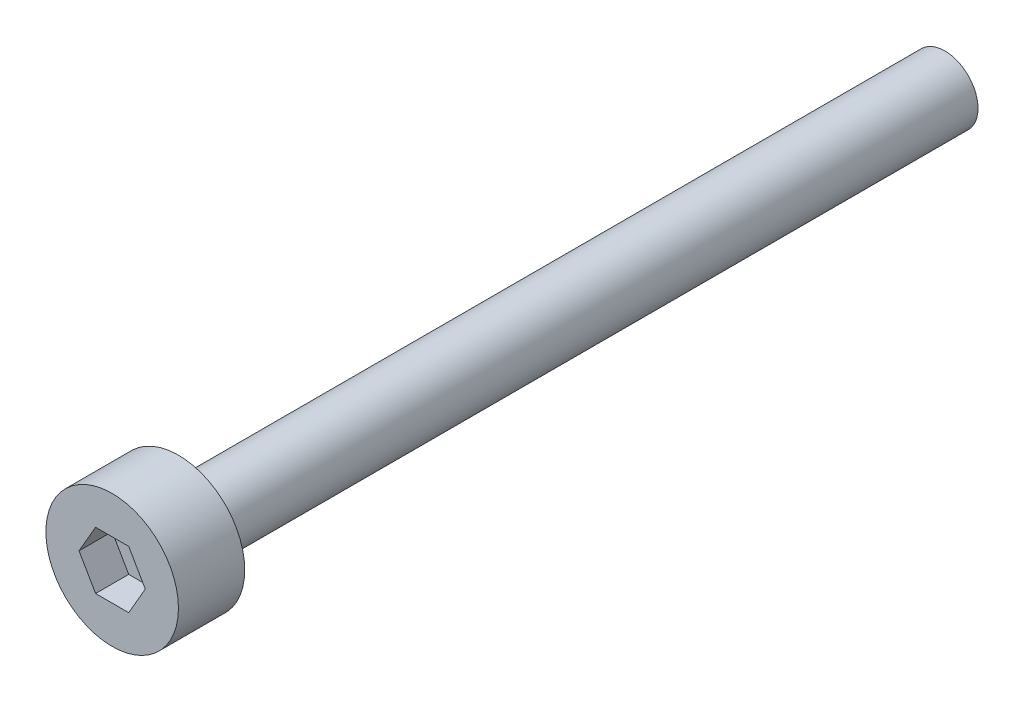
ISO-10303-21;
HEADER;
FILE_DESCRIPTION(('STEP AP214'),'2;1');
FILE_NAME('part.step','',(''),(''),'','','');
FILE_SCHEMA(('AUTOMOTIVE_DESIGN { 1 0 10303 214 1 1 1 1 }'));
ENDSEC;
DATA;
#1=APPLICATION_CONTEXT('core data for automotive mechanical design processes');
#2=APPLICATION_PROTOCOL_DEFINITION('international standard','automotive_design',2000,#1);
#3=PRODUCT_CONTEXT('',#1,'mechanical');
#4=PRODUCT('Part','Part','',(#3));
#5=PRODUCT_RELATED_PRODUCT_CATEGORY('part','',(#4));
#6=PRODUCT_DEFINITION_FORMATION('','',#4);
#7=PRODUCT_DEFINITION_CONTEXT('part definition',#1,'design');
#8=PRODUCT_DEFINITION('design','',#6,#7);
#9=PRODUCT_DEFINITION_SHAPE('','',#8);
#10=(LENGTH_UNIT() NAMED_UNIT(*) SI_UNIT(.MILLI.,.METRE.));
#11=(NAMED_UNIT(*) PLANE_ANGLE_UNIT() SI_UNIT($,.RADIAN.));
#12=(NAMED_UNIT(*) SI_UNIT($,.STERADIAN.) SOLID_ANGLE_UNIT());
#13=UNCERTAINTY_MEASURE_WITH_UNIT(LENGTH_MEASURE(1.E-05),#10,'distance_accuracy_value','');
#14=(GEOMETRIC_REPRESENTATION_CONTEXT(3) GLOBAL_UNCERTAINTY_ASSIGNED_CONTEXT((#13)) GLOBAL_UNIT_ASSIGNED_CONTEXT((#10,
#11,#12)) REPRESENTATION_CONTEXT('',''));
#15=CARTESIAN_POINT('',(0.,0.,0.));
#16=DIRECTION('',(0.,0.,1.));
#17=DIRECTION('',(1.,0.,0.));
#18=AXIS2_PLACEMENT_3D('',#15,#16,#17);
#19=CARTESIAN_POINT('',(0.,0.,1.6));
#20=DIRECTION('',(0.,0.,-1.));
#21=DIRECTION('',(-1.,0.,0.));
#22=AXIS2_PLACEMENT_3D('',#19,#20,#21);
#23=CYLINDRICAL_SURFACE('',#22,1.6);
#24=CARTESIAN_POINT('',(0.,0.,1.6));
#25=DIRECTION('',(0.,0.,1.));
#26=DIRECTION('',(1.,0.,0.));
#27=AXIS2_PLACEMENT_3D('',#24,#25,#26);
#28=CIRCLE('',#27,1.6);
#29=CARTESIAN_POINT('',(1.6,0.,1.6));
#30=VERTEX_POINT('',#29);
#31=EDGE_CURVE('E11',#30,#30,#28,.T.);
#32=ORIENTED_EDGE('',*,*,#31,.F.);
#33=EDGE_LOOP('',(#32));
#34=FACE_BOUND('',#33,.T.);
#35=CARTESIAN_POINT('',(0.,0.,0.));
#36=DIRECTION('',(0.,0.,1.));
#37=DIRECTION('',(1.,0.,0.));
#38=AXIS2_PLACEMENT_3D('',#35,#36,#37);
#39=CIRCLE('',#38,1.6);
#40=CARTESIAN_POINT('',(1.6,0.,0.));
#41=VERTEX_POINT('',#40);
#42=EDGE_CURVE('E35',#41,#41,#39,.T.);
#43=ORIENTED_EDGE('',*,*,#42,.T.);
#44=EDGE_LOOP('',(#43));
#45=FACE_BOUND('',#44,.T.);
#46=ADVANCED_FACE('F32',(#34,#45),#23,.T.);
#47=CARTESIAN_POINT('',(0.,0.,1.6));
#48=DIRECTION('',(0.,0.,1.));
#49=DIRECTION('',(1.,0.,0.));
#50=AXIS2_PLACEMENT_3D('',#47,#48,#49);
#51=PLANE('',#50);
#52=DIRECTION('',(0.5,0.866025403784439,0.));
#53=VECTOR('',#52,1.);
#54=CARTESIAN_POINT('',(0.4,-0.692820323027551,1.6));
#55=LINE('',#54,#53);
#56=CARTESIAN_POINT('',(0.4,-0.692820323027551,1.6));
#57=VERTEX_POINT('',#56);
#58=CARTESIAN_POINT('',(0.8,0.,1.6));
#59=VERTEX_POINT('',#58);
#60=EDGE_CURVE('E46',#57,#59,#55,.T.);
#61=ORIENTED_EDGE('',*,*,#60,.F.);
#62=DIRECTION('',(1.,0.,0.));
#63=VECTOR('',#62,1.);
#64=CARTESIAN_POINT('',(-0.4,-0.692820323027551,1.6));
#65=LINE('',#64,#63);
#66=CARTESIAN_POINT('',(-0.4,-0.692820323027551,1.6));
#67=VERTEX_POINT('',#66);
#68=EDGE_CURVE('E129',#67,#57,#65,.T.);
#69=ORIENTED_EDGE('',*,*,#68,.F.);
#70=DIRECTION('',(0.5,-0.866025403784439,0.));
#71=VECTOR('',#70,1.);
#72=CARTESIAN_POINT('',(-0.8,0.,1.6));
#73=LINE('',#72,#71);
#74=CARTESIAN_POINT('',(-0.8,0.,1.6));
#75=VERTEX_POINT('',#74);
#76=EDGE_CURVE('E127',#75,#67,#73,.T.);
#77=ORIENTED_EDGE('',*,*,#76,.F.);
#78=DIRECTION('',(-0.5,-0.866025403784439,0.));
#79=VECTOR('',#78,1.);
#80=CARTESIAN_POINT('',(-0.4,0.692820323027551,1.6));
#81=LINE('',#80,#79);
#82=CARTESIAN_POINT('',(-0.4,0.692820323027551,1.6));
#83=VERTEX_POINT('',#82);
#84=EDGE_CURVE('E94',#83,#75,#81,.T.);
#85=ORIENTED_EDGE('',*,*,#84,.F.);
#86=DIRECTION('',(-1.,0.,0.));
#87=VECTOR('',#86,1.);
#88=CARTESIAN_POINT('',(0.4,0.692820323027551,1.6));
#89=LINE('',#88,#87);
#90=CARTESIAN_POINT('',(0.4,0.692820323027551,1.6));
#91=VERTEX_POINT('',#90);
#92=EDGE_CURVE('E123',#91,#83,#89,.T.);
#93=ORIENTED_EDGE('',*,*,#92,.F.);
#94=DIRECTION('',(-0.5,0.866025403784439,0.));
#95=VECTOR('',#94,1.);
#96=CARTESIAN_POINT('',(0.8,0.,1.6));
#97=LINE('',#96,#95);
#98=EDGE_CURVE('E120',#59,#91,#97,.T.);
#99=ORIENTED_EDGE('',*,*,#98,.F.);
#100=EDGE_LOOP('',(#61,#69,#77,#85,#93,#99));
#101=FACE_BOUND('',#100,.T.);
#102=ORIENTED_EDGE('',*,*,#31,.T.);
#103=EDGE_LOOP('',(#102));
#104=FACE_BOUND('',#103,.T.);
#105=ADVANCED_FACE('F160',(#101,#104),#51,.T.);
#106=CARTESIAN_POINT('',(0.,0.,0.));
#107=DIRECTION('',(0.,0.,1.));
#108=DIRECTION('',(1.,0.,0.));
#109=AXIS2_PLACEMENT_3D('',#106,#107,#108);
#110=PLANE('',#109);
#111=CARTESIAN_POINT('',(0.,0.,0.));
#112=DIRECTION('',(0.,0.,1.));
#113=DIRECTION('',(1.,0.,0.));
#114=AXIS2_PLACEMENT_3D('',#111,#112,#113);
#115=CIRCLE('',#114,0.8);
#116=CARTESIAN_POINT('',(0.8,0.,0.));
#117=VERTEX_POINT('',#116);
#118=EDGE_CURVE('E133',#117,#117,#115,.T.);
#119=ORIENTED_EDGE('',*,*,#118,.T.);
#120=EDGE_LOOP('',(#119));
#121=FACE_BOUND('',#120,.T.);
#122=ORIENTED_EDGE('',*,*,#42,.F.);
#123=EDGE_LOOP('',(#122));
#124=FACE_BOUND('',#123,.T.);
#125=ADVANCED_FACE('F145',(#121,#124),#110,.F.);
#126=CARTESIAN_POINT('',(0.,0.,-18.5));
#127=DIRECTION('',(0.,0.,1.));
#128=DIRECTION('',(1.,0.,0.));
#129=AXIS2_PLACEMENT_3D('',#126,#127,#128);
#130=CYLINDRICAL_SURFACE('',#129,0.8);
#131=CARTESIAN_POINT('',(0.,0.,-18.5));
#132=DIRECTION('',(0.,0.,1.));
#133=DIRECTION('',(1.,0.,0.));
#134=AXIS2_PLACEMENT_3D('',#131,#132,#133);
#135=CIRCLE('',#134,0.8);
#136=CARTESIAN_POINT('',(0.8,0.,-18.5));
#137=VERTEX_POINT('',#136);
#138=EDGE_CURVE('E139',#137,#137,#135,.T.);
#139=ORIENTED_EDGE('',*,*,#138,.T.);
#140=EDGE_LOOP('',(#139));
#141=FACE_BOUND('',#140,.T.);
#142=ORIENTED_EDGE('',*,*,#118,.F.);
#143=EDGE_LOOP('',(#142));
#144=FACE_BOUND('',#143,.T.);
#145=ADVANCED_FACE('F148',(#141,#144),#130,.T.);
#146=CARTESIAN_POINT('',(0.,0.,-18.5));
#147=DIRECTION('',(0.,0.,1.));
#148=DIRECTION('',(1.,0.,0.));
#149=AXIS2_PLACEMENT_3D('',#146,#147,#148);
#150=PLANE('',#149);
#151=ORIENTED_EDGE('',*,*,#138,.F.);
#152=EDGE_LOOP('',(#151));
#153=FACE_BOUND('',#152,.T.);
#154=ADVANCED_FACE('F150',(#153),#150,.F.);
#155=CARTESIAN_POINT('',(0.4,-0.692820323027551,0.8));
#156=DIRECTION('',(0.866025403784439,-0.5,0.));
#157=DIRECTION('',(0.5,0.866025403784439,0.));
#158=AXIS2_PLACEMENT_3D('',#155,#156,#157);
#159=PLANE('',#158);
#160=ORIENTED_EDGE('',*,*,#60,.T.);
#161=DIRECTION('',(0.,0.,1.));
#162=VECTOR('',#161,1.);
#163=CARTESIAN_POINT('',(0.8,0.,0.8));
#164=LINE('',#163,#162);
#165=CARTESIAN_POINT('',(0.8,0.,0.8));
#166=VERTEX_POINT('',#165);
#167=EDGE_CURVE('E76',#166,#59,#164,.T.);
#168=ORIENTED_EDGE('',*,*,#167,.F.);
#169=DIRECTION('',(0.5,0.866025403784439,0.));
#170=VECTOR('',#169,1.);
#171=CARTESIAN_POINT('',(0.4,-0.692820323027551,0.8));
#172=LINE('',#171,#170);
#173=CARTESIAN_POINT('',(0.4,-0.692820323027551,0.8));
#174=VERTEX_POINT('',#173);
#175=EDGE_CURVE('E131',#174,#166,#172,.T.);
#176=ORIENTED_EDGE('',*,*,#175,.F.);
#177=DIRECTION('',(0.,0.,1.));
#178=VECTOR('',#177,1.);
#179=CARTESIAN_POINT('',(0.4,-0.692820323027551,0.8));
#180=LINE('',#179,#178);
#181=EDGE_CURVE('E54',#174,#57,#180,.T.);
#182=ORIENTED_EDGE('',*,*,#181,.T.);
#183=EDGE_LOOP('',(#160,#168,#176,#182));
#184=FACE_BOUND('',#183,.T.);
#185=ADVANCED_FACE('F157',(#184),#159,.F.);
#186=CARTESIAN_POINT('',(-0.4,-0.692820323027551,0.8));
#187=DIRECTION('',(0.,-1.,0.));
#188=DIRECTION('',(0.,0.,-1.));
#189=AXIS2_PLACEMENT_3D('',#186,#187,#188);
#190=PLANE('',#189);
#191=ORIENTED_EDGE('',*,*,#68,.T.);
#192=ORIENTED_EDGE('',*,*,#181,.F.);
#193=DIRECTION('',(1.,0.,0.));
#194=VECTOR('',#193,1.);
#195=CARTESIAN_POINT('',(-0.4,-0.692820323027551,0.8));
#196=LINE('',#195,#194);
#197=CARTESIAN_POINT('',(-0.4,-0.692820323027551,0.8));
#198=VERTEX_POINT('',#197);
#199=EDGE_CURVE('E106',#198,#174,#196,.T.);
#200=ORIENTED_EDGE('',*,*,#199,.F.);
#201=DIRECTION('',(0.,0.,1.));
#202=VECTOR('',#201,1.);
#203=CARTESIAN_POINT('',(-0.4,-0.692820323027551,0.8));
#204=LINE('',#203,#202);
#205=EDGE_CURVE('E98',#198,#67,#204,.T.);
#206=ORIENTED_EDGE('',*,*,#205,.T.);
#207=EDGE_LOOP('',(#191,#192,#200,#206));
#208=FACE_BOUND('',#207,.T.);
#209=ADVANCED_FACE('F182',(#208),#190,.F.);
#210=CARTESIAN_POINT('',(-0.8,0.,0.8));
#211=DIRECTION('',(-0.866025403784439,-0.5,0.));
#212=DIRECTION('',(0.5,-0.866025403784439,0.));
#213=AXIS2_PLACEMENT_3D('',#210,#211,#212);
#214=PLANE('',#213);
#215=ORIENTED_EDGE('',*,*,#76,.T.);
#216=ORIENTED_EDGE('',*,*,#205,.F.);
#217=DIRECTION('',(0.5,-0.866025403784439,0.));
#218=VECTOR('',#217,1.);
#219=CARTESIAN_POINT('',(-0.8,0.,0.8));
#220=LINE('',#219,#218);
#221=CARTESIAN_POINT('',(-0.8,0.,0.8));
#222=VERTEX_POINT('',#221);
#223=EDGE_CURVE('E102',#222,#198,#220,.T.);
#224=ORIENTED_EDGE('',*,*,#223,.F.);
#225=DIRECTION('',(0.,0.,1.));
#226=VECTOR('',#225,1.);
#227=CARTESIAN_POINT('',(-0.8,0.,0.8));
#228=LINE('',#227,#226);
#229=EDGE_CURVE('E87',#222,#75,#228,.T.);
#230=ORIENTED_EDGE('',*,*,#229,.T.);
#231=EDGE_LOOP('',(#215,#216,#224,#230));
#232=FACE_BOUND('',#231,.T.);
#233=ADVANCED_FACE('F103',(#232),#214,.F.);
#234=CARTESIAN_POINT('',(-0.4,0.692820323027551,0.8));
#235=DIRECTION('',(-0.866025403784439,0.5,0.));
#236=DIRECTION('',(-0.5,-0.866025403784439,0.));
#237=AXIS2_PLACEMENT_3D('',#234,#235,#236);
#238=PLANE('',#237);
#239=ORIENTED_EDGE('',*,*,#84,.T.);
#240=ORIENTED_EDGE('',*,*,#229,.F.);
#241=DIRECTION('',(-0.5,-0.866025403784439,0.));
#242=VECTOR('',#241,1.);
#243=CARTESIAN_POINT('',(-0.4,0.692820323027551,0.8));
#244=LINE('',#243,#242);
#245=CARTESIAN_POINT('',(-0.4,0.692820323027551,0.8));
#246=VERTEX_POINT('',#245);
#247=EDGE_CURVE('E91',#246,#222,#244,.T.);
#248=ORIENTED_EDGE('',*,*,#247,.F.);
#249=DIRECTION('',(0.,0.,1.));
#250=VECTOR('',#249,1.);
#251=CARTESIAN_POINT('',(-0.4,0.692820323027551,0.8));
#252=LINE('',#251,#250);
#253=EDGE_CURVE('E99',#246,#83,#252,.T.);
#254=ORIENTED_EDGE('',*,*,#253,.T.);
#255=EDGE_LOOP('',(#239,#240,#248,#254));
#256=FACE_BOUND('',#255,.T.);
#257=ADVANCED_FACE('F89',(#256),#238,.F.);
#258=CARTESIAN_POINT('',(0.4,0.692820323027551,0.8));
#259=DIRECTION('',(0.,1.,0.));
#260=DIRECTION('',(-1.,0.,0.));
#261=AXIS2_PLACEMENT_3D('',#258,#259,#260);
#262=PLANE('',#261);
#263=ORIENTED_EDGE('',*,*,#92,.T.);
#264=ORIENTED_EDGE('',*,*,#253,.F.);
#265=DIRECTION('',(-1.,0.,0.));
#266=VECTOR('',#265,1.);
#267=CARTESIAN_POINT('',(0.4,0.692820323027551,0.8));
#268=LINE('',#267,#266);
#269=CARTESIAN_POINT('',(0.4,0.692820323027551,0.8));
#270=VERTEX_POINT('',#269);
#271=EDGE_CURVE('E112',#270,#246,#268,.T.);
#272=ORIENTED_EDGE('',*,*,#271,.F.);
#273=DIRECTION('',(0.,0.,1.));
#274=VECTOR('',#273,1.);
#275=CARTESIAN_POINT('',(0.4,0.692820323027551,0.8));
#276=LINE('',#275,#274);
#277=EDGE_CURVE('E136',#270,#91,#276,.T.);
#278=ORIENTED_EDGE('',*,*,#277,.T.);
#279=EDGE_LOOP('',(#263,#264,#272,#278));
#280=FACE_BOUND('',#279,.T.);
#281=ADVANCED_FACE('F191',(#280),#262,.F.);
#282=CARTESIAN_POINT('',(0.8,0.,0.8));
#283=DIRECTION('',(0.866025403784439,0.5,0.));
#284=DIRECTION('',(-0.5,0.866025403784439,0.));
#285=AXIS2_PLACEMENT_3D('',#282,#283,#284);
#286=PLANE('',#285);
#287=ORIENTED_EDGE('',*,*,#98,.T.);
#288=ORIENTED_EDGE('',*,*,#277,.F.);
#289=DIRECTION('',(-0.5,0.866025403784439,0.));
#290=VECTOR('',#289,1.);
#291=CARTESIAN_POINT('',(0.8,0.,0.8));
#292=LINE('',#291,#290);
#293=EDGE_CURVE('E114',#166,#270,#292,.T.);
#294=ORIENTED_EDGE('',*,*,#293,.F.);
#295=ORIENTED_EDGE('',*,*,#167,.T.);
#296=EDGE_LOOP('',(#287,#288,#294,#295));
#297=FACE_BOUND('',#296,.T.);
#298=ADVANCED_FACE('F179',(#297),#286,.F.);
#299=CARTESIAN_POINT('',(0.,0.,0.8));
#300=DIRECTION('',(0.,0.,1.));
#301=DIRECTION('',(1.,0.,0.));
#302=AXIS2_PLACEMENT_3D('',#299,#300,#301);
#303=PLANE('',#302);
#304=ORIENTED_EDGE('',*,*,#175,.T.);
#305=ORIENTED_EDGE('',*,*,#293,.T.);
#306=ORIENTED_EDGE('',*,*,#271,.T.);
#307=ORIENTED_EDGE('',*,*,#247,.T.);
#308=ORIENTED_EDGE('',*,*,#223,.T.);
#309=ORIENTED_EDGE('',*,*,#199,.T.);
#310=EDGE_LOOP('',(#304,#305,#306,#307,#308,#309));
#311=FACE_BOUND('',#310,.T.);
#312=ADVANCED_FACE('F109',(#311),#303,.T.);
#313=CLOSED_SHELL('',(#46,#105,#125,#145,#154,#185,#209,#233,#257,#281,#298,#312));
#314=MANIFOLD_SOLID_BREP('B2',#313);
#315=ADVANCED_BREP_SHAPE_REPRESENTATION('',(#18,#314),#14);
#316=SHAPE_DEFINITION_REPRESENTATION(#9,#315);
ENDSEC;
END-ISO-10303-21;
